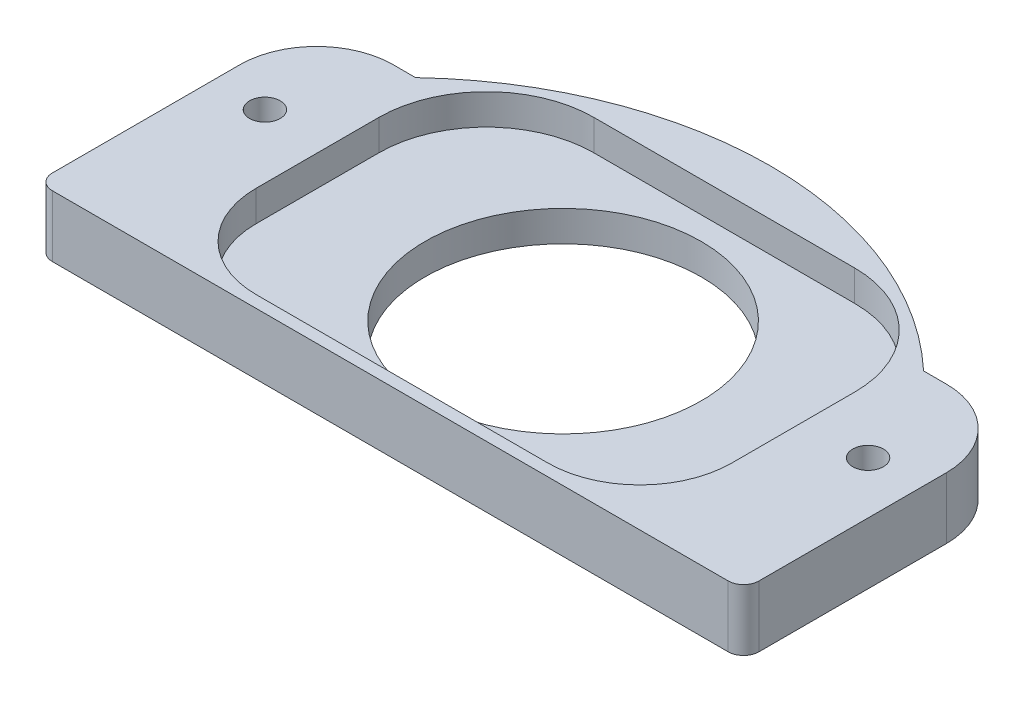
ISO-10303-21;
HEADER;
FILE_DESCRIPTION(('STEP AP214'),'2;1');
FILE_NAME('part.step','',(''),(''),'','','');
FILE_SCHEMA(('AUTOMOTIVE_DESIGN { 1 0 10303 214 1 1 1 1 }'));
ENDSEC;
DATA;
#1=APPLICATION_CONTEXT('core data for automotive mechanical design processes');
#2=APPLICATION_PROTOCOL_DEFINITION('international standard','automotive_design',2000,#1);
#3=PRODUCT_CONTEXT('',#1,'mechanical');
#4=PRODUCT('Part','Part','',(#3));
#5=PRODUCT_RELATED_PRODUCT_CATEGORY('part','',(#4));
#6=PRODUCT_DEFINITION_FORMATION('','',#4);
#7=PRODUCT_DEFINITION_CONTEXT('part definition',#1,'design');
#8=PRODUCT_DEFINITION('design','',#6,#7);
#9=PRODUCT_DEFINITION_SHAPE('','',#8);
#10=(LENGTH_UNIT() NAMED_UNIT(*) SI_UNIT(.MILLI.,.METRE.));
#11=(NAMED_UNIT(*) PLANE_ANGLE_UNIT() SI_UNIT($,.RADIAN.));
#12=(NAMED_UNIT(*) SI_UNIT($,.STERADIAN.) SOLID_ANGLE_UNIT());
#13=UNCERTAINTY_MEASURE_WITH_UNIT(LENGTH_MEASURE(1.E-05),#10,'distance_accuracy_value','');
#14=(GEOMETRIC_REPRESENTATION_CONTEXT(3) GLOBAL_UNCERTAINTY_ASSIGNED_CONTEXT((#13)) GLOBAL_UNIT_ASSIGNED_CONTEXT((#10,
#11,#12)) REPRESENTATION_CONTEXT('',''));
#15=CARTESIAN_POINT('',(0.,0.,0.));
#16=DIRECTION('',(0.,0.,1.));
#17=DIRECTION('',(1.,0.,0.));
#18=AXIS2_PLACEMENT_3D('',#15,#16,#17);
#19=CARTESIAN_POINT('',(0.,4.,1.23521374546822));
#20=DIRECTION('',(0.,1.,0.));
#21=DIRECTION('',(0.,0.,1.));
#22=AXIS2_PLACEMENT_3D('',#19,#20,#21);
#23=CYLINDRICAL_SURFACE('',#22,9.);
#24=CARTESIAN_POINT('',(0.,0.,1.23521374546822));
#25=DIRECTION('',(0.,1.,0.));
#26=DIRECTION('',(0.,0.,1.));
#27=AXIS2_PLACEMENT_3D('',#24,#25,#26);
#28=CIRCLE('',#27,9.);
#29=CARTESIAN_POINT('',(0.,0.,10.2352137454682));
#30=VERTEX_POINT('',#29);
#31=EDGE_CURVE('E163',#30,#30,#28,.T.);
#32=ORIENTED_EDGE('',*,*,#31,.F.);
#33=EDGE_LOOP('',(#32));
#34=FACE_BOUND('',#33,.T.);
#35=CARTESIAN_POINT('',(0.,2.,1.23521374546822));
#36=DIRECTION('',(0.,1.,0.));
#37=DIRECTION('',(0.,0.,1.));
#38=AXIS2_PLACEMENT_3D('',#35,#36,#37);
#39=CIRCLE('',#38,9.);
#40=CARTESIAN_POINT('',(0.,2.,10.2352137454682));
#41=VERTEX_POINT('',#40);
#42=EDGE_CURVE('E37',#41,#41,#39,.F.);
#43=ORIENTED_EDGE('',*,*,#42,.F.);
#44=EDGE_LOOP('',(#43));
#45=FACE_BOUND('',#44,.T.);
#46=ADVANCED_FACE('F33',(#34,#45),#23,.F.);
#47=CARTESIAN_POINT('',(-18.,4.,-0.700000000000001));
#48=DIRECTION('',(0.,-1.,0.));
#49=DIRECTION('',(0.,0.,-1.));
#50=AXIS2_PLACEMENT_3D('',#47,#48,#49);
#51=CYLINDRICAL_SURFACE('',#50,5.);
#52=CARTESIAN_POINT('',(-18.,0.,-0.700000000000001));
#53=DIRECTION('',(0.,1.,0.));
#54=DIRECTION('',(0.,0.,1.));
#55=AXIS2_PLACEMENT_3D('',#52,#53,#54);
#56=CIRCLE('',#55,5.);
#57=CARTESIAN_POINT('',(-18.,0.,-5.7));
#58=VERTEX_POINT('',#57);
#59=CARTESIAN_POINT('',(-23.,0.,-0.7));
#60=VERTEX_POINT('',#59);
#61=EDGE_CURVE('E160',#58,#60,#56,.T.);
#62=ORIENTED_EDGE('',*,*,#61,.T.);
#63=DIRECTION('',(0.,-1.,0.));
#64=VECTOR('',#63,1.);
#65=CARTESIAN_POINT('',(-23.,4.,-0.7));
#66=LINE('',#65,#64);
#67=CARTESIAN_POINT('',(-23.,4.,-0.7));
#68=VERTEX_POINT('',#67);
#69=EDGE_CURVE('E11',#68,#60,#66,.T.);
#70=ORIENTED_EDGE('',*,*,#69,.F.);
#71=CARTESIAN_POINT('',(-18.,4.,-0.700000000000001));
#72=DIRECTION('',(0.,1.,0.));
#73=DIRECTION('',(0.,0.,1.));
#74=AXIS2_PLACEMENT_3D('',#71,#72,#73);
#75=CIRCLE('',#74,5.);
#76=CARTESIAN_POINT('',(-18.,4.,-5.7));
#77=VERTEX_POINT('',#76);
#78=EDGE_CURVE('E187',#77,#68,#75,.T.);
#79=ORIENTED_EDGE('',*,*,#78,.F.);
#80=DIRECTION('',(0.,-1.,0.));
#81=VECTOR('',#80,1.);
#82=CARTESIAN_POINT('',(-18.,4.,-5.7));
#83=LINE('',#82,#81);
#84=EDGE_CURVE('E59',#77,#58,#83,.T.);
#85=ORIENTED_EDGE('',*,*,#84,.T.);
#86=EDGE_LOOP('',(#62,#70,#79,#85));
#87=FACE_BOUND('',#86,.T.);
#88=ADVANCED_FACE('F35',(#87),#51,.T.);
#89=CARTESIAN_POINT('',(-23.,4.,-0.7));
#90=DIRECTION('',(1.,0.,0.));
#91=DIRECTION('',(0.,0.,-1.));
#92=AXIS2_PLACEMENT_3D('',#89,#90,#91);
#93=PLANE('',#92);
#94=DIRECTION('',(0.,0.,1.));
#95=VECTOR('',#94,1.);
#96=CARTESIAN_POINT('',(-23.,0.,-0.7));
#97=LINE('',#96,#95);
#98=CARTESIAN_POINT('',(-23.,0.,11.5147862545318));
#99=VERTEX_POINT('',#98);
#100=EDGE_CURVE('E162',#60,#99,#97,.T.);
#101=ORIENTED_EDGE('',*,*,#100,.T.);
#102=DIRECTION('',(0.,-1.,0.));
#103=VECTOR('',#102,1.);
#104=CARTESIAN_POINT('',(-23.,4.,11.5147862545318));
#105=LINE('',#104,#103);
#106=CARTESIAN_POINT('',(-23.,4.,11.5147862545318));
#107=VERTEX_POINT('',#106);
#108=EDGE_CURVE('E42',#107,#99,#105,.T.);
#109=ORIENTED_EDGE('',*,*,#108,.F.);
#110=DIRECTION('',(0.,0.,1.));
#111=VECTOR('',#110,1.);
#112=CARTESIAN_POINT('',(-23.,4.,-0.7));
#113=LINE('',#112,#111);
#114=EDGE_CURVE('E104',#68,#107,#113,.T.);
#115=ORIENTED_EDGE('',*,*,#114,.F.);
#116=ORIENTED_EDGE('',*,*,#69,.T.);
#117=EDGE_LOOP('',(#101,#109,#115,#116));
#118=FACE_BOUND('',#117,.T.);
#119=ADVANCED_FACE('F262',(#118),#93,.F.);
#120=CARTESIAN_POINT('',(-22.,4.,11.5147862545318));
#121=DIRECTION('',(0.,-1.,0.));
#122=DIRECTION('',(0.,0.,-1.));
#123=AXIS2_PLACEMENT_3D('',#120,#121,#122);
#124=CYLINDRICAL_SURFACE('',#123,1.);
#125=CARTESIAN_POINT('',(-22.,0.,11.5147862545318));
#126=DIRECTION('',(0.,-1.,0.));
#127=DIRECTION('',(0.,0.,-1.));
#128=AXIS2_PLACEMENT_3D('',#125,#126,#127);
#129=CIRCLE('',#128,1.);
#130=CARTESIAN_POINT('',(-22.,0.,12.5147862545318));
#131=VERTEX_POINT('',#130);
#132=EDGE_CURVE('E166',#131,#99,#129,.T.);
#133=ORIENTED_EDGE('',*,*,#132,.F.);
#134=DIRECTION('',(0.,-1.,0.));
#135=VECTOR('',#134,1.);
#136=CARTESIAN_POINT('',(-22.,4.,12.5147862545318));
#137=LINE('',#136,#135);
#138=CARTESIAN_POINT('',(-22.,4.,12.5147862545318));
#139=VERTEX_POINT('',#138);
#140=EDGE_CURVE('E197',#139,#131,#137,.T.);
#141=ORIENTED_EDGE('',*,*,#140,.F.);
#142=CARTESIAN_POINT('',(-22.,4.,11.5147862545318));
#143=DIRECTION('',(0.,-1.,0.));
#144=DIRECTION('',(0.,0.,-1.));
#145=AXIS2_PLACEMENT_3D('',#142,#143,#144);
#146=CIRCLE('',#145,1.);
#147=EDGE_CURVE('E224',#139,#107,#146,.T.);
#148=ORIENTED_EDGE('',*,*,#147,.T.);
#149=ORIENTED_EDGE('',*,*,#108,.T.);
#150=EDGE_LOOP('',(#133,#141,#148,#149));
#151=FACE_BOUND('',#150,.T.);
#152=ADVANCED_FACE('F440',(#151),#124,.T.);
#153=CARTESIAN_POINT('',(-22.,4.,12.5147862545318));
#154=DIRECTION('',(0.,0.,-1.));
#155=DIRECTION('',(-1.,0.,0.));
#156=AXIS2_PLACEMENT_3D('',#153,#154,#155);
#157=PLANE('',#156);
#158=DIRECTION('',(1.,0.,0.));
#159=VECTOR('',#158,1.);
#160=CARTESIAN_POINT('',(-22.,0.,12.5147862545318));
#161=LINE('',#160,#159);
#162=CARTESIAN_POINT('',(22.037708346053,0.,12.5147862545318));
#163=VERTEX_POINT('',#162);
#164=EDGE_CURVE('E169',#131,#163,#161,.T.);
#165=ORIENTED_EDGE('',*,*,#164,.T.);
#166=DIRECTION('',(0.,-1.,0.));
#167=VECTOR('',#166,1.);
#168=CARTESIAN_POINT('',(22.037708346053,4.,12.5147862545318));
#169=LINE('',#168,#167);
#170=CARTESIAN_POINT('',(22.037708346053,4.,12.5147862545318));
#171=VERTEX_POINT('',#170);
#172=EDGE_CURVE('E195',#171,#163,#169,.T.);
#173=ORIENTED_EDGE('',*,*,#172,.F.);
#174=DIRECTION('',(1.,0.,0.));
#175=VECTOR('',#174,1.);
#176=CARTESIAN_POINT('',(-22.,4.,12.5147862545318));
#177=LINE('',#176,#175);
#178=EDGE_CURVE('E227',#139,#171,#177,.T.);
#179=ORIENTED_EDGE('',*,*,#178,.F.);
#180=ORIENTED_EDGE('',*,*,#140,.T.);
#181=EDGE_LOOP('',(#165,#173,#179,#180));
#182=FACE_BOUND('',#181,.T.);
#183=ADVANCED_FACE('F432',(#182),#157,.F.);
#184=CARTESIAN_POINT('',(22.037708346053,4.,11.5147862545318));
#185=DIRECTION('',(0.,-1.,0.));
#186=DIRECTION('',(0.,0.,-1.));
#187=AXIS2_PLACEMENT_3D('',#184,#185,#186);
#188=CYLINDRICAL_SURFACE('',#187,1.);
#189=CARTESIAN_POINT('',(22.037708346053,0.,11.5147862545318));
#190=DIRECTION('',(0.,-1.,0.));
#191=DIRECTION('',(0.,0.,-1.));
#192=AXIS2_PLACEMENT_3D('',#189,#190,#191);
#193=CIRCLE('',#192,1.);
#194=CARTESIAN_POINT('',(23.037708346053,0.,11.5147862545318));
#195=VERTEX_POINT('',#194);
#196=EDGE_CURVE('E172',#195,#163,#193,.T.);
#197=ORIENTED_EDGE('',*,*,#196,.F.);
#198=DIRECTION('',(0.,-1.,0.));
#199=VECTOR('',#198,1.);
#200=CARTESIAN_POINT('',(23.037708346053,4.,11.5147862545318));
#201=LINE('',#200,#199);
#202=CARTESIAN_POINT('',(23.037708346053,4.,11.5147862545318));
#203=VERTEX_POINT('',#202);
#204=EDGE_CURVE('E193',#203,#195,#201,.T.);
#205=ORIENTED_EDGE('',*,*,#204,.F.);
#206=CARTESIAN_POINT('',(22.037708346053,4.,11.5147862545318));
#207=DIRECTION('',(0.,-1.,0.));
#208=DIRECTION('',(0.,0.,-1.));
#209=AXIS2_PLACEMENT_3D('',#206,#207,#208);
#210=CIRCLE('',#209,1.);
#211=EDGE_CURVE('E229',#203,#171,#210,.T.);
#212=ORIENTED_EDGE('',*,*,#211,.T.);
#213=ORIENTED_EDGE('',*,*,#172,.T.);
#214=EDGE_LOOP('',(#197,#205,#212,#213));
#215=FACE_BOUND('',#214,.T.);
#216=ADVANCED_FACE('F241',(#215),#188,.T.);
#217=CARTESIAN_POINT('',(23.037708346053,4.,-0.700000000000002));
#218=DIRECTION('',(1.,0.,0.));
#219=DIRECTION('',(0.,0.,-1.));
#220=AXIS2_PLACEMENT_3D('',#217,#218,#219);
#221=PLANE('',#220);
#222=DIRECTION('',(0.,0.,1.));
#223=VECTOR('',#222,1.);
#224=CARTESIAN_POINT('',(23.037708346053,0.,-0.700000000000002));
#225=LINE('',#224,#223);
#226=CARTESIAN_POINT('',(23.037708346053,0.,-0.700000000000002));
#227=VERTEX_POINT('',#226);
#228=EDGE_CURVE('E175',#227,#195,#225,.T.);
#229=ORIENTED_EDGE('',*,*,#228,.F.);
#230=DIRECTION('',(0.,-1.,0.));
#231=VECTOR('',#230,1.);
#232=CARTESIAN_POINT('',(23.037708346053,4.,-0.700000000000002));
#233=LINE('',#232,#231);
#234=CARTESIAN_POINT('',(23.037708346053,4.,-0.700000000000002));
#235=VERTEX_POINT('',#234);
#236=EDGE_CURVE('E191',#235,#227,#233,.T.);
#237=ORIENTED_EDGE('',*,*,#236,.F.);
#238=DIRECTION('',(0.,0.,1.));
#239=VECTOR('',#238,1.);
#240=CARTESIAN_POINT('',(23.037708346053,4.,-0.700000000000002));
#241=LINE('',#240,#239);
#242=EDGE_CURVE('E155',#235,#203,#241,.T.);
#243=ORIENTED_EDGE('',*,*,#242,.T.);
#244=ORIENTED_EDGE('',*,*,#204,.T.);
#245=EDGE_LOOP('',(#229,#237,#243,#244));
#246=FACE_BOUND('',#245,.T.);
#247=ADVANCED_FACE('F234',(#246),#221,.T.);
#248=CARTESIAN_POINT('',(18.037708346053,4.,-0.700000000000002));
#249=DIRECTION('',(0.,-1.,0.));
#250=DIRECTION('',(0.,0.,-1.));
#251=AXIS2_PLACEMENT_3D('',#248,#249,#250);
#252=CYLINDRICAL_SURFACE('',#251,5.);
#253=CARTESIAN_POINT('',(18.037708346053,0.,-0.700000000000002));
#254=DIRECTION('',(0.,1.,0.));
#255=DIRECTION('',(0.,0.,1.));
#256=AXIS2_PLACEMENT_3D('',#253,#254,#255);
#257=CIRCLE('',#256,5.);
#258=CARTESIAN_POINT('',(18.037708346053,0.,-5.7));
#259=VERTEX_POINT('',#258);
#260=EDGE_CURVE('E178',#227,#259,#257,.T.);
#261=ORIENTED_EDGE('',*,*,#260,.T.);
#262=DIRECTION('',(0.,-1.,0.));
#263=VECTOR('',#262,1.);
#264=CARTESIAN_POINT('',(18.037708346053,4.,-5.7));
#265=LINE('',#264,#263);
#266=CARTESIAN_POINT('',(18.037708346053,4.,-5.7));
#267=VERTEX_POINT('',#266);
#268=EDGE_CURVE('E139',#267,#259,#265,.T.);
#269=ORIENTED_EDGE('',*,*,#268,.F.);
#270=CARTESIAN_POINT('',(18.037708346053,4.,-0.700000000000002));
#271=DIRECTION('',(0.,1.,0.));
#272=DIRECTION('',(0.,0.,1.));
#273=AXIS2_PLACEMENT_3D('',#270,#271,#272);
#274=CIRCLE('',#273,5.);
#275=EDGE_CURVE('E152',#235,#267,#274,.T.);
#276=ORIENTED_EDGE('',*,*,#275,.F.);
#277=ORIENTED_EDGE('',*,*,#236,.T.);
#278=EDGE_LOOP('',(#261,#269,#276,#277));
#279=FACE_BOUND('',#278,.T.);
#280=ADVANCED_FACE('F247',(#279),#252,.T.);
#281=CARTESIAN_POINT('',(16.5494461766478,4.,-5.70000000000001));
#282=DIRECTION('',(0.,0.,-1.));
#283=DIRECTION('',(-1.,0.,0.));
#284=AXIS2_PLACEMENT_3D('',#281,#282,#283);
#285=PLANE('',#284);
#286=DIRECTION('',(1.,0.,0.));
#287=VECTOR('',#286,1.);
#288=CARTESIAN_POINT('',(16.5494461766478,0.,-5.70000000000001));
#289=LINE('',#288,#287);
#290=CARTESIAN_POINT('',(16.5494461766478,0.,-5.70000000000001));
#291=VERTEX_POINT('',#290);
#292=EDGE_CURVE('E135',#291,#259,#289,.T.);
#293=ORIENTED_EDGE('',*,*,#292,.F.);
#294=DIRECTION('',(0.,-1.,0.));
#295=VECTOR('',#294,1.);
#296=CARTESIAN_POINT('',(16.5494461766478,4.,-5.70000000000001));
#297=LINE('',#296,#295);
#298=CARTESIAN_POINT('',(16.5494461766478,4.,-5.70000000000001));
#299=VERTEX_POINT('',#298);
#300=EDGE_CURVE('E129',#299,#291,#297,.T.);
#301=ORIENTED_EDGE('',*,*,#300,.F.);
#302=DIRECTION('',(1.,0.,0.));
#303=VECTOR('',#302,1.);
#304=CARTESIAN_POINT('',(16.5494461766478,4.,-5.70000000000001));
#305=LINE('',#304,#303);
#306=EDGE_CURVE('E133',#299,#267,#305,.T.);
#307=ORIENTED_EDGE('',*,*,#306,.T.);
#308=ORIENTED_EDGE('',*,*,#268,.T.);
#309=EDGE_LOOP('',(#293,#301,#307,#308));
#310=FACE_BOUND('',#309,.T.);
#311=ADVANCED_FACE('F131',(#310),#285,.T.);
#312=CARTESIAN_POINT('',(0.,4.,11.8192988229049));
#313=DIRECTION('',(0.,-1.,0.));
#314=DIRECTION('',(0.,0.,-1.));
#315=AXIS2_PLACEMENT_3D('',#312,#313,#314);
#316=CYLINDRICAL_SURFACE('',#315,24.1);
#317=CARTESIAN_POINT('',(0.,0.,11.8192988229049));
#318=DIRECTION('',(0.,1.,0.));
#319=DIRECTION('',(0.,0.,1.));
#320=AXIS2_PLACEMENT_3D('',#317,#318,#319);
#321=CIRCLE('',#320,24.1);
#322=CARTESIAN_POINT('',(-16.5494461766478,0.,-5.7));
#323=VERTEX_POINT('',#322);
#324=EDGE_CURVE('E182',#291,#323,#321,.T.);
#325=ORIENTED_EDGE('',*,*,#324,.T.);
#326=DIRECTION('',(0.,-1.,0.));
#327=VECTOR('',#326,1.);
#328=CARTESIAN_POINT('',(-16.5494461766478,4.,-5.7));
#329=LINE('',#328,#327);
#330=CARTESIAN_POINT('',(-16.5494461766478,4.,-5.7));
#331=VERTEX_POINT('',#330);
#332=EDGE_CURVE('E140',#331,#323,#329,.T.);
#333=ORIENTED_EDGE('',*,*,#332,.F.);
#334=CARTESIAN_POINT('',(0.,4.,11.8192988229049));
#335=DIRECTION('',(0.,1.,0.));
#336=DIRECTION('',(0.,0.,1.));
#337=AXIS2_PLACEMENT_3D('',#334,#335,#336);
#338=CIRCLE('',#337,24.1);
#339=EDGE_CURVE('E143',#299,#331,#338,.T.);
#340=ORIENTED_EDGE('',*,*,#339,.F.);
#341=ORIENTED_EDGE('',*,*,#300,.T.);
#342=EDGE_LOOP('',(#325,#333,#340,#341));
#343=FACE_BOUND('',#342,.T.);
#344=ADVANCED_FACE('F144',(#343),#316,.T.);
#345=CARTESIAN_POINT('',(-18.,4.,-5.7));
#346=DIRECTION('',(0.,0.,-1.));
#347=DIRECTION('',(-1.,0.,0.));
#348=AXIS2_PLACEMENT_3D('',#345,#346,#347);
#349=PLANE('',#348);
#350=DIRECTION('',(1.,0.,0.));
#351=VECTOR('',#350,1.);
#352=CARTESIAN_POINT('',(-18.,0.,-5.7));
#353=LINE('',#352,#351);
#354=EDGE_CURVE('E184',#58,#323,#353,.T.);
#355=ORIENTED_EDGE('',*,*,#354,.F.);
#356=ORIENTED_EDGE('',*,*,#84,.F.);
#357=DIRECTION('',(1.,0.,0.));
#358=VECTOR('',#357,1.);
#359=CARTESIAN_POINT('',(-18.,4.,-5.7));
#360=LINE('',#359,#358);
#361=EDGE_CURVE('E147',#77,#331,#360,.T.);
#362=ORIENTED_EDGE('',*,*,#361,.T.);
#363=ORIENTED_EDGE('',*,*,#332,.T.);
#364=EDGE_LOOP('',(#355,#356,#362,#363));
#365=FACE_BOUND('',#364,.T.);
#366=ADVANCED_FACE('F271',(#365),#349,.T.);
#367=CARTESIAN_POINT('',(-18.,4.,-0.700000000000001));
#368=DIRECTION('',(0.,1.,0.));
#369=DIRECTION('',(0.,0.,1.));
#370=AXIS2_PLACEMENT_3D('',#367,#368,#369);
#371=PLANE('',#370);
#372=CARTESIAN_POINT('',(8.5,4.,-2.26478625453178));
#373=DIRECTION('',(0.,1.,0.));
#374=DIRECTION('',(0.,0.,1.));
#375=AXIS2_PLACEMENT_3D('',#372,#373,#374);
#376=CIRCLE('',#375,7.);
#377=CARTESIAN_POINT('',(15.5,4.,-2.26478625453173));
#378=VERTEX_POINT('',#377);
#379=CARTESIAN_POINT('',(8.49999999999995,4.,-9.26478625453178));
#380=VERTEX_POINT('',#379);
#381=EDGE_CURVE('E50',#378,#380,#376,.T.);
#382=ORIENTED_EDGE('',*,*,#381,.F.);
#383=DIRECTION('',(0.,0.,-1.));
#384=VECTOR('',#383,1.);
#385=CARTESIAN_POINT('',(15.5,4.,-2.26478625453173));
#386=LINE('',#385,#384);
#387=CARTESIAN_POINT('',(15.5,4.,5.73521374546818));
#388=VERTEX_POINT('',#387);
#389=EDGE_CURVE('E505',#388,#378,#386,.T.);
#390=ORIENTED_EDGE('',*,*,#389,.F.);
#391=CARTESIAN_POINT('',(9.5,4.,5.73521374546822));
#392=DIRECTION('',(0.,1.,0.));
#393=DIRECTION('',(0.,0.,-1.));
#394=AXIS2_PLACEMENT_3D('',#391,#392,#393);
#395=CIRCLE('',#394,6.);
#396=CARTESIAN_POINT('',(9.49999999999996,4.,11.7352137454682));
#397=VERTEX_POINT('',#396);
#398=EDGE_CURVE('E502',#397,#388,#395,.T.);
#399=ORIENTED_EDGE('',*,*,#398,.F.);
#400=DIRECTION('',(1.,0.,0.));
#401=VECTOR('',#400,1.);
#402=CARTESIAN_POINT('',(-9.49999999999996,4.,11.7352137454682));
#403=LINE('',#402,#401);
#404=CARTESIAN_POINT('',(-9.49999999999996,4.,11.7352137454682));
#405=VERTEX_POINT('',#404);
#406=EDGE_CURVE('E499',#405,#397,#403,.T.);
#407=ORIENTED_EDGE('',*,*,#406,.F.);
#408=CARTESIAN_POINT('',(-9.5,4.,5.73521374546822));
#409=DIRECTION('',(0.,1.,0.));
#410=DIRECTION('',(0.,0.,-1.));
#411=AXIS2_PLACEMENT_3D('',#408,#409,#410);
#412=CIRCLE('',#411,6.);
#413=CARTESIAN_POINT('',(-15.5,4.,5.73521374546818));
#414=VERTEX_POINT('',#413);
#415=EDGE_CURVE('E493',#414,#405,#412,.T.);
#416=ORIENTED_EDGE('',*,*,#415,.F.);
#417=DIRECTION('',(0.,0.,1.));
#418=VECTOR('',#417,1.);
#419=CARTESIAN_POINT('',(-15.5,4.,-2.26478625453173));
#420=LINE('',#419,#418);
#421=CARTESIAN_POINT('',(-15.5,4.,-2.26478625453173));
#422=VERTEX_POINT('',#421);
#423=EDGE_CURVE('E490',#422,#414,#420,.T.);
#424=ORIENTED_EDGE('',*,*,#423,.F.);
#425=CARTESIAN_POINT('',(-8.5,4.,-2.26478625453178));
#426=DIRECTION('',(0.,1.,0.));
#427=DIRECTION('',(0.,0.,1.));
#428=AXIS2_PLACEMENT_3D('',#425,#426,#427);
#429=CIRCLE('',#428,7.);
#430=CARTESIAN_POINT('',(-8.49999999999995,4.,-9.26478625453178));
#431=VERTEX_POINT('',#430);
#432=EDGE_CURVE('E483',#431,#422,#429,.T.);
#433=ORIENTED_EDGE('',*,*,#432,.F.);
#434=DIRECTION('',(-1.,0.,0.));
#435=VECTOR('',#434,1.);
#436=CARTESIAN_POINT('',(-8.49999999999995,4.,-9.26478625453178));
#437=LINE('',#436,#435);
#438=EDGE_CURVE('E474',#380,#431,#437,.T.);
#439=ORIENTED_EDGE('',*,*,#438,.F.);
#440=EDGE_LOOP('',(#382,#390,#399,#407,#416,#424,#433,#439));
#441=FACE_BOUND('',#440,.T.);
#442=CARTESIAN_POINT('',(-19.65,4.,1.01478625453178));
#443=DIRECTION('',(0.,1.,0.));
#444=DIRECTION('',(0.,0.,1.));
#445=AXIS2_PLACEMENT_3D('',#442,#443,#444);
#446=CIRCLE('',#445,0.999999999999997);
#447=CARTESIAN_POINT('',(-19.65,4.,2.01478625453178));
#448=VERTEX_POINT('',#447);
#449=EDGE_CURVE('E205',#448,#448,#446,.T.);
#450=ORIENTED_EDGE('',*,*,#449,.F.);
#451=EDGE_LOOP('',(#450));
#452=FACE_BOUND('',#451,.T.);
#453=CARTESIAN_POINT('',(19.65,4.,1.01478625453178));
#454=DIRECTION('',(0.,1.,0.));
#455=DIRECTION('',(0.,0.,1.));
#456=AXIS2_PLACEMENT_3D('',#453,#454,#455);
#457=CIRCLE('',#456,0.999999999999997);
#458=CARTESIAN_POINT('',(19.65,4.,2.01478625453178));
#459=VERTEX_POINT('',#458);
#460=EDGE_CURVE('E202',#459,#459,#457,.T.);
#461=ORIENTED_EDGE('',*,*,#460,.F.);
#462=EDGE_LOOP('',(#461));
#463=FACE_BOUND('',#462,.T.);
#464=ORIENTED_EDGE('',*,*,#78,.T.);
#465=ORIENTED_EDGE('',*,*,#114,.T.);
#466=ORIENTED_EDGE('',*,*,#147,.F.);
#467=ORIENTED_EDGE('',*,*,#178,.T.);
#468=ORIENTED_EDGE('',*,*,#211,.F.);
#469=ORIENTED_EDGE('',*,*,#242,.F.);
#470=ORIENTED_EDGE('',*,*,#275,.T.);
#471=ORIENTED_EDGE('',*,*,#306,.F.);
#472=ORIENTED_EDGE('',*,*,#339,.T.);
#473=ORIENTED_EDGE('',*,*,#361,.F.);
#474=EDGE_LOOP('',(#464,#465,#466,#467,#468,#469,#470,#471,#472,#473));
#475=FACE_BOUND('',#474,.T.);
#476=ADVANCED_FACE('F149',(#441,#452,#463,#475),#371,.T.);
#477=CARTESIAN_POINT('',(-18.,0.,-0.700000000000001));
#478=DIRECTION('',(0.,1.,0.));
#479=DIRECTION('',(0.,0.,1.));
#480=AXIS2_PLACEMENT_3D('',#477,#478,#479);
#481=PLANE('',#480);
#482=CARTESIAN_POINT('',(-19.65,0.,1.01478625453178));
#483=DIRECTION('',(0.,1.,0.));
#484=DIRECTION('',(0.,0.,1.));
#485=AXIS2_PLACEMENT_3D('',#482,#483,#484);
#486=CIRCLE('',#485,0.999999999999997);
#487=CARTESIAN_POINT('',(-19.65,0.,2.01478625453178));
#488=VERTEX_POINT('',#487);
#489=EDGE_CURVE('E203',#488,#488,#486,.T.);
#490=ORIENTED_EDGE('',*,*,#489,.T.);
#491=EDGE_LOOP('',(#490));
#492=FACE_BOUND('',#491,.T.);
#493=CARTESIAN_POINT('',(19.65,0.,1.01478625453178));
#494=DIRECTION('',(0.,1.,0.));
#495=DIRECTION('',(0.,0.,1.));
#496=AXIS2_PLACEMENT_3D('',#493,#494,#495);
#497=CIRCLE('',#496,0.999999999999997);
#498=CARTESIAN_POINT('',(19.65,0.,2.01478625453178));
#499=VERTEX_POINT('',#498);
#500=EDGE_CURVE('E200',#499,#499,#497,.T.);
#501=ORIENTED_EDGE('',*,*,#500,.T.);
#502=EDGE_LOOP('',(#501));
#503=FACE_BOUND('',#502,.T.);
#504=ORIENTED_EDGE('',*,*,#31,.T.);
#505=EDGE_LOOP('',(#504));
#506=FACE_BOUND('',#505,.T.);
#507=ORIENTED_EDGE('',*,*,#61,.F.);
#508=ORIENTED_EDGE('',*,*,#354,.T.);
#509=ORIENTED_EDGE('',*,*,#324,.F.);
#510=ORIENTED_EDGE('',*,*,#292,.T.);
#511=ORIENTED_EDGE('',*,*,#260,.F.);
#512=ORIENTED_EDGE('',*,*,#228,.T.);
#513=ORIENTED_EDGE('',*,*,#196,.T.);
#514=ORIENTED_EDGE('',*,*,#164,.F.);
#515=ORIENTED_EDGE('',*,*,#132,.T.);
#516=ORIENTED_EDGE('',*,*,#100,.F.);
#517=EDGE_LOOP('',(#507,#508,#509,#510,#511,#512,#513,#514,#515,#516));
#518=FACE_BOUND('',#517,.T.);
#519=ADVANCED_FACE('F245',(#492,#503,#506,#518),#481,.F.);
#520=CARTESIAN_POINT('',(19.65,4.,1.01478625453178));
#521=DIRECTION('',(0.,1.,0.));
#522=DIRECTION('',(0.,0.,1.));
#523=AXIS2_PLACEMENT_3D('',#520,#521,#522);
#524=CYLINDRICAL_SURFACE('',#523,0.999999999999997);
#525=ORIENTED_EDGE('',*,*,#460,.T.);
#526=EDGE_LOOP('',(#525));
#527=FACE_BOUND('',#526,.T.);
#528=ORIENTED_EDGE('',*,*,#500,.F.);
#529=EDGE_LOOP('',(#528));
#530=FACE_BOUND('',#529,.T.);
#531=ADVANCED_FACE('F267',(#527,#530),#524,.F.);
#532=CARTESIAN_POINT('',(-19.65,4.,1.01478625453178));
#533=DIRECTION('',(0.,1.,0.));
#534=DIRECTION('',(0.,0.,1.));
#535=AXIS2_PLACEMENT_3D('',#532,#533,#534);
#536=CYLINDRICAL_SURFACE('',#535,0.999999999999997);
#537=ORIENTED_EDGE('',*,*,#449,.T.);
#538=EDGE_LOOP('',(#537));
#539=FACE_BOUND('',#538,.T.);
#540=ORIENTED_EDGE('',*,*,#489,.F.);
#541=EDGE_LOOP('',(#540));
#542=FACE_BOUND('',#541,.T.);
#543=ADVANCED_FACE('F301',(#539,#542),#536,.F.);
#544=CARTESIAN_POINT('',(8.5,2.,-2.26478625453178));
#545=DIRECTION('',(0.,1.,0.));
#546=DIRECTION('',(0.,0.,1.));
#547=AXIS2_PLACEMENT_3D('',#544,#545,#546);
#548=PLANE('',#547);
#549=CARTESIAN_POINT('',(8.5,2.,-2.26478625453178));
#550=DIRECTION('',(0.,1.,0.));
#551=DIRECTION('',(0.,0.,1.));
#552=AXIS2_PLACEMENT_3D('',#549,#550,#551);
#553=CIRCLE('',#552,7.);
#554=CARTESIAN_POINT('',(15.5,2.,-2.26478625453173));
#555=VERTEX_POINT('',#554);
#556=CARTESIAN_POINT('',(8.49999999999995,2.,-9.26478625453178));
#557=VERTEX_POINT('',#556);
#558=EDGE_CURVE('E508',#555,#557,#553,.T.);
#559=ORIENTED_EDGE('',*,*,#558,.T.);
#560=DIRECTION('',(-1.,0.,0.));
#561=VECTOR('',#560,1.);
#562=CARTESIAN_POINT('',(-8.49999999999995,2.,-9.26478625453178));
#563=LINE('',#562,#561);
#564=CARTESIAN_POINT('',(-8.49999999999995,2.,-9.26478625453178));
#565=VERTEX_POINT('',#564);
#566=EDGE_CURVE('E545',#557,#565,#563,.T.);
#567=ORIENTED_EDGE('',*,*,#566,.T.);
#568=CARTESIAN_POINT('',(-8.5,2.,-2.26478625453178));
#569=DIRECTION('',(0.,1.,0.));
#570=DIRECTION('',(0.,0.,1.));
#571=AXIS2_PLACEMENT_3D('',#568,#569,#570);
#572=CIRCLE('',#571,7.);
#573=CARTESIAN_POINT('',(-15.5,2.,-2.26478625453173));
#574=VERTEX_POINT('',#573);
#575=EDGE_CURVE('E542',#565,#574,#572,.T.);
#576=ORIENTED_EDGE('',*,*,#575,.T.);
#577=DIRECTION('',(0.,0.,1.));
#578=VECTOR('',#577,1.);
#579=CARTESIAN_POINT('',(-15.5,2.,-2.26478625453173));
#580=LINE('',#579,#578);
#581=CARTESIAN_POINT('',(-15.5,2.,5.73521374546818));
#582=VERTEX_POINT('',#581);
#583=EDGE_CURVE('E539',#574,#582,#580,.T.);
#584=ORIENTED_EDGE('',*,*,#583,.T.);
#585=CARTESIAN_POINT('',(-9.5,2.,5.73521374546822));
#586=DIRECTION('',(0.,1.,0.));
#587=DIRECTION('',(0.,0.,-1.));
#588=AXIS2_PLACEMENT_3D('',#585,#586,#587);
#589=CIRCLE('',#588,6.);
#590=CARTESIAN_POINT('',(-9.49999999999996,2.,11.7352137454682));
#591=VERTEX_POINT('',#590);
#592=EDGE_CURVE('E536',#582,#591,#589,.T.);
#593=ORIENTED_EDGE('',*,*,#592,.T.);
#594=DIRECTION('',(1.,0.,0.));
#595=VECTOR('',#594,1.);
#596=CARTESIAN_POINT('',(-9.49999999999996,2.,11.7352137454682));
#597=LINE('',#596,#595);
#598=CARTESIAN_POINT('',(9.49999999999996,2.,11.7352137454682));
#599=VERTEX_POINT('',#598);
#600=EDGE_CURVE('E531',#591,#599,#597,.T.);
#601=ORIENTED_EDGE('',*,*,#600,.T.);
#602=CARTESIAN_POINT('',(9.5,2.,5.73521374546822));
#603=DIRECTION('',(0.,1.,0.));
#604=DIRECTION('',(0.,0.,-1.));
#605=AXIS2_PLACEMENT_3D('',#602,#603,#604);
#606=CIRCLE('',#605,6.);
#607=CARTESIAN_POINT('',(15.5,2.,5.73521374546818));
#608=VERTEX_POINT('',#607);
#609=EDGE_CURVE('E526',#599,#608,#606,.T.);
#610=ORIENTED_EDGE('',*,*,#609,.T.);
#611=DIRECTION('',(0.,0.,-1.));
#612=VECTOR('',#611,1.);
#613=CARTESIAN_POINT('',(15.5,2.,-2.26478625453173));
#614=LINE('',#613,#612);
#615=EDGE_CURVE('E524',#608,#555,#614,.T.);
#616=ORIENTED_EDGE('',*,*,#615,.T.);
#617=EDGE_LOOP('',(#559,#567,#576,#584,#593,#601,#610,#616));
#618=FACE_BOUND('',#617,.T.);
#619=ORIENTED_EDGE('',*,*,#42,.T.);
#620=EDGE_LOOP('',(#619));
#621=FACE_BOUND('',#620,.T.);
#622=ADVANCED_FACE('F308',(#618,#621),#548,.T.);
#623=CARTESIAN_POINT('',(8.5,2.,-2.26478625453178));
#624=DIRECTION('',(0.,1.,0.));
#625=DIRECTION('',(0.,0.,1.));
#626=AXIS2_PLACEMENT_3D('',#623,#624,#625);
#627=CYLINDRICAL_SURFACE('',#626,7.);
#628=ORIENTED_EDGE('',*,*,#381,.T.);
#629=DIRECTION('',(0.,1.,0.));
#630=VECTOR('',#629,1.);
#631=CARTESIAN_POINT('',(8.49999999999995,2.,-9.26478625453178));
#632=LINE('',#631,#630);
#633=EDGE_CURVE('E217',#557,#380,#632,.T.);
#634=ORIENTED_EDGE('',*,*,#633,.F.);
#635=ORIENTED_EDGE('',*,*,#558,.F.);
#636=DIRECTION('',(0.,1.,0.));
#637=VECTOR('',#636,1.);
#638=CARTESIAN_POINT('',(15.5,2.,-2.26478625453173));
#639=LINE('',#638,#637);
#640=EDGE_CURVE('E215',#555,#378,#639,.T.);
#641=ORIENTED_EDGE('',*,*,#640,.T.);
#642=EDGE_LOOP('',(#628,#634,#635,#641));
#643=FACE_BOUND('',#642,.T.);
#644=ADVANCED_FACE('F313',(#643),#627,.F.);
#645=CARTESIAN_POINT('',(15.5,2.,-2.26478625453173));
#646=DIRECTION('',(1.,0.,0.));
#647=DIRECTION('',(0.,0.,-1.));
#648=AXIS2_PLACEMENT_3D('',#645,#646,#647);
#649=PLANE('',#648);
#650=ORIENTED_EDGE('',*,*,#389,.T.);
#651=ORIENTED_EDGE('',*,*,#640,.F.);
#652=ORIENTED_EDGE('',*,*,#615,.F.);
#653=DIRECTION('',(0.,1.,0.));
#654=VECTOR('',#653,1.);
#655=CARTESIAN_POINT('',(15.5,2.,5.73521374546818));
#656=LINE('',#655,#654);
#657=EDGE_CURVE('E510',#608,#388,#656,.T.);
#658=ORIENTED_EDGE('',*,*,#657,.T.);
#659=EDGE_LOOP('',(#650,#651,#652,#658));
#660=FACE_BOUND('',#659,.T.);
#661=ADVANCED_FACE('F321',(#660),#649,.F.);
#662=CARTESIAN_POINT('',(9.5,2.,5.73521374546822));
#663=DIRECTION('',(0.,1.,0.));
#664=DIRECTION('',(0.,0.,1.));
#665=AXIS2_PLACEMENT_3D('',#662,#663,#664);
#666=CYLINDRICAL_SURFACE('',#665,6.);
#667=ORIENTED_EDGE('',*,*,#398,.T.);
#668=ORIENTED_EDGE('',*,*,#657,.F.);
#669=ORIENTED_EDGE('',*,*,#609,.F.);
#670=DIRECTION('',(0.,1.,0.));
#671=VECTOR('',#670,1.);
#672=CARTESIAN_POINT('',(9.49999999999996,2.,11.7352137454682));
#673=LINE('',#672,#671);
#674=EDGE_CURVE('E513',#599,#397,#673,.T.);
#675=ORIENTED_EDGE('',*,*,#674,.T.);
#676=EDGE_LOOP('',(#667,#668,#669,#675));
#677=FACE_BOUND('',#676,.T.);
#678=ADVANCED_FACE('F328',(#677),#666,.F.);
#679=CARTESIAN_POINT('',(-9.49999999999996,2.,11.7352137454682));
#680=DIRECTION('',(0.,0.,1.));
#681=DIRECTION('',(1.,0.,0.));
#682=AXIS2_PLACEMENT_3D('',#679,#680,#681);
#683=PLANE('',#682);
#684=ORIENTED_EDGE('',*,*,#406,.T.);
#685=ORIENTED_EDGE('',*,*,#674,.F.);
#686=ORIENTED_EDGE('',*,*,#600,.F.);
#687=DIRECTION('',(0.,1.,0.));
#688=VECTOR('',#687,1.);
#689=CARTESIAN_POINT('',(-9.49999999999996,2.,11.7352137454682));
#690=LINE('',#689,#688);
#691=EDGE_CURVE('E516',#591,#405,#690,.T.);
#692=ORIENTED_EDGE('',*,*,#691,.T.);
#693=EDGE_LOOP('',(#684,#685,#686,#692));
#694=FACE_BOUND('',#693,.T.);
#695=ADVANCED_FACE('F336',(#694),#683,.F.);
#696=CARTESIAN_POINT('',(-9.5,2.,5.73521374546822));
#697=DIRECTION('',(0.,1.,0.));
#698=DIRECTION('',(0.,0.,1.));
#699=AXIS2_PLACEMENT_3D('',#696,#697,#698);
#700=CYLINDRICAL_SURFACE('',#699,6.);
#701=ORIENTED_EDGE('',*,*,#415,.T.);
#702=ORIENTED_EDGE('',*,*,#691,.F.);
#703=ORIENTED_EDGE('',*,*,#592,.F.);
#704=DIRECTION('',(0.,1.,0.));
#705=VECTOR('',#704,1.);
#706=CARTESIAN_POINT('',(-15.5,2.,5.73521374546818));
#707=LINE('',#706,#705);
#708=EDGE_CURVE('E519',#582,#414,#707,.T.);
#709=ORIENTED_EDGE('',*,*,#708,.T.);
#710=EDGE_LOOP('',(#701,#702,#703,#709));
#711=FACE_BOUND('',#710,.T.);
#712=ADVANCED_FACE('F344',(#711),#700,.F.);
#713=CARTESIAN_POINT('',(-15.5,2.,-2.26478625453173));
#714=DIRECTION('',(-1.,0.,0.));
#715=DIRECTION('',(0.,0.,1.));
#716=AXIS2_PLACEMENT_3D('',#713,#714,#715);
#717=PLANE('',#716);
#718=ORIENTED_EDGE('',*,*,#423,.T.);
#719=ORIENTED_EDGE('',*,*,#708,.F.);
#720=ORIENTED_EDGE('',*,*,#583,.F.);
#721=DIRECTION('',(0.,1.,0.));
#722=VECTOR('',#721,1.);
#723=CARTESIAN_POINT('',(-15.5,2.,-2.26478625453173));
#724=LINE('',#723,#722);
#725=EDGE_CURVE('E522',#574,#422,#724,.T.);
#726=ORIENTED_EDGE('',*,*,#725,.T.);
#727=EDGE_LOOP('',(#718,#719,#720,#726));
#728=FACE_BOUND('',#727,.T.);
#729=ADVANCED_FACE('F352',(#728),#717,.F.);
#730=CARTESIAN_POINT('',(-8.5,2.,-2.26478625453178));
#731=DIRECTION('',(0.,1.,0.));
#732=DIRECTION('',(0.,0.,1.));
#733=AXIS2_PLACEMENT_3D('',#730,#731,#732);
#734=CYLINDRICAL_SURFACE('',#733,7.);
#735=ORIENTED_EDGE('',*,*,#432,.T.);
#736=ORIENTED_EDGE('',*,*,#725,.F.);
#737=ORIENTED_EDGE('',*,*,#575,.F.);
#738=DIRECTION('',(0.,1.,0.));
#739=VECTOR('',#738,1.);
#740=CARTESIAN_POINT('',(-8.49999999999995,2.,-9.26478625453178));
#741=LINE('',#740,#739);
#742=EDGE_CURVE('E479',#565,#431,#741,.T.);
#743=ORIENTED_EDGE('',*,*,#742,.T.);
#744=EDGE_LOOP('',(#735,#736,#737,#743));
#745=FACE_BOUND('',#744,.T.);
#746=ADVANCED_FACE('F360',(#745),#734,.F.);
#747=CARTESIAN_POINT('',(-8.49999999999995,2.,-9.26478625453178));
#748=DIRECTION('',(0.,0.,-1.));
#749=DIRECTION('',(-1.,0.,0.));
#750=AXIS2_PLACEMENT_3D('',#747,#748,#749);
#751=PLANE('',#750);
#752=ORIENTED_EDGE('',*,*,#438,.T.);
#753=ORIENTED_EDGE('',*,*,#742,.F.);
#754=ORIENTED_EDGE('',*,*,#566,.F.);
#755=ORIENTED_EDGE('',*,*,#633,.T.);
#756=EDGE_LOOP('',(#752,#753,#754,#755));
#757=FACE_BOUND('',#756,.T.);
#758=ADVANCED_FACE('F368',(#757),#751,.F.);
#759=CLOSED_SHELL('',(#46,#88,#119,#152,#183,#216,#247,#280,#311,#344,#366,#476,#519,#531,#543,
#622,#644,#661,#678,#695,#712,#729,#746,#758));
#760=MANIFOLD_SOLID_BREP('B2',#759);
#761=ADVANCED_BREP_SHAPE_REPRESENTATION('',(#18,#760),#14);
#762=SHAPE_DEFINITION_REPRESENTATION(#9,#761);
ENDSEC;
END-ISO-10303-21;
